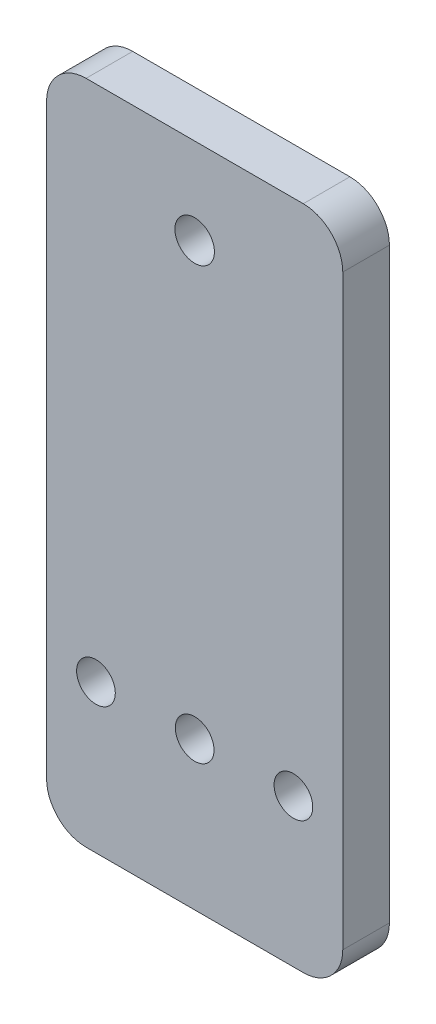
ISO-10303-21;
HEADER;
FILE_DESCRIPTION(('STEP AP214'),'2;1');
FILE_NAME('part.step','',(''),(''),'','','');
FILE_SCHEMA(('AUTOMOTIVE_DESIGN { 1 0 10303 214 1 1 1 1 }'));
ENDSEC;
DATA;
#1=APPLICATION_CONTEXT('core data for automotive mechanical design processes');
#2=APPLICATION_PROTOCOL_DEFINITION('international standard','automotive_design',2000,#1);
#3=PRODUCT_CONTEXT('',#1,'mechanical');
#4=PRODUCT('Part','Part','',(#3));
#5=PRODUCT_RELATED_PRODUCT_CATEGORY('part','',(#4));
#6=PRODUCT_DEFINITION_FORMATION('','',#4);
#7=PRODUCT_DEFINITION_CONTEXT('part definition',#1,'design');
#8=PRODUCT_DEFINITION('design','',#6,#7);
#9=PRODUCT_DEFINITION_SHAPE('','',#8);
#10=(LENGTH_UNIT() NAMED_UNIT(*) SI_UNIT(.MILLI.,.METRE.));
#11=(NAMED_UNIT(*) PLANE_ANGLE_UNIT() SI_UNIT($,.RADIAN.));
#12=(NAMED_UNIT(*) SI_UNIT($,.STERADIAN.) SOLID_ANGLE_UNIT());
#13=UNCERTAINTY_MEASURE_WITH_UNIT(LENGTH_MEASURE(1.E-05),#10,'distance_accuracy_value','');
#14=(GEOMETRIC_REPRESENTATION_CONTEXT(3) GLOBAL_UNCERTAINTY_ASSIGNED_CONTEXT((#13)) GLOBAL_UNIT_ASSIGNED_CONTEXT((#10,
#11,#12)) REPRESENTATION_CONTEXT('',''));
#15=CARTESIAN_POINT('',(0.,0.,0.));
#16=DIRECTION('',(0.,0.,1.));
#17=DIRECTION('',(1.,0.,0.));
#18=AXIS2_PLACEMENT_3D('',#15,#16,#17);
#19=CARTESIAN_POINT('',(-354.33,-13.97,6.));
#20=DIRECTION('',(0.,0.,1.));
#21=DIRECTION('',(1.,0.,0.));
#22=AXIS2_PLACEMENT_3D('',#19,#20,#21);
#23=PLANE('',#22);
#24=CARTESIAN_POINT('',(-381.,0.,6.));
#25=DIRECTION('',(0.,0.,1.));
#26=DIRECTION('',(1.,0.,0.));
#27=AXIS2_PLACEMENT_3D('',#24,#25,#26);
#28=CIRCLE('',#27,2.4892);
#29=CARTESIAN_POINT('',(-378.5108,0.,6.));
#30=VERTEX_POINT('',#29);
#31=EDGE_CURVE('E221',#30,#30,#28,.T.);
#32=ORIENTED_EDGE('',*,*,#31,.F.);
#33=EDGE_LOOP('',(#32));
#34=FACE_BOUND('',#33,.T.);
#35=CARTESIAN_POINT('',(-368.3,0.,6.));
#36=DIRECTION('',(0.,0.,1.));
#37=DIRECTION('',(1.,0.,0.));
#38=AXIS2_PLACEMENT_3D('',#35,#36,#37);
#39=CIRCLE('',#38,2.4892);
#40=CARTESIAN_POINT('',(-365.8108,0.,6.));
#41=VERTEX_POINT('',#40);
#42=EDGE_CURVE('E146',#41,#41,#39,.T.);
#43=ORIENTED_EDGE('',*,*,#42,.F.);
#44=EDGE_LOOP('',(#43));
#45=FACE_BOUND('',#44,.T.);
#46=CARTESIAN_POINT('',(-354.33,-13.97,6.));
#47=DIRECTION('',(0.,0.,1.));
#48=DIRECTION('',(1.,0.,0.));
#49=AXIS2_PLACEMENT_3D('',#46,#47,#48);
#50=CIRCLE('',#49,5.07999999999999);
#51=CARTESIAN_POINT('',(-354.33,-19.05,6.));
#52=VERTEX_POINT('',#51);
#53=CARTESIAN_POINT('',(-349.25,-13.97,6.));
#54=VERTEX_POINT('',#53);
#55=EDGE_CURVE('E164',#52,#54,#50,.T.);
#56=ORIENTED_EDGE('',*,*,#55,.T.);
#57=DIRECTION('',(0.,1.,0.));
#58=VECTOR('',#57,1.);
#59=CARTESIAN_POINT('',(-349.25,-13.97,6.));
#60=LINE('',#59,#58);
#61=CARTESIAN_POINT('',(-349.25,61.53,6.));
#62=VERTEX_POINT('',#61);
#63=EDGE_CURVE('E100',#54,#62,#60,.T.);
#64=ORIENTED_EDGE('',*,*,#63,.T.);
#65=CARTESIAN_POINT('',(-354.33,61.53,6.));
#66=DIRECTION('',(0.,0.,1.));
#67=DIRECTION('',(1.,0.,0.));
#68=AXIS2_PLACEMENT_3D('',#65,#66,#67);
#69=CIRCLE('',#68,5.07999999999999);
#70=CARTESIAN_POINT('',(-354.33,66.61,6.));
#71=VERTEX_POINT('',#70);
#72=EDGE_CURVE('E185',#62,#71,#69,.T.);
#73=ORIENTED_EDGE('',*,*,#72,.T.);
#74=DIRECTION('',(-1.,0.,0.));
#75=VECTOR('',#74,1.);
#76=CARTESIAN_POINT('',(-354.33,66.61,6.));
#77=LINE('',#76,#75);
#78=CARTESIAN_POINT('',(-382.27,66.61,6.));
#79=VERTEX_POINT('',#78);
#80=EDGE_CURVE('E199',#71,#79,#77,.T.);
#81=ORIENTED_EDGE('',*,*,#80,.T.);
#82=CARTESIAN_POINT('',(-382.27,61.53,6.));
#83=DIRECTION('',(0.,0.,1.));
#84=DIRECTION('',(1.,0.,0.));
#85=AXIS2_PLACEMENT_3D('',#82,#83,#84);
#86=CIRCLE('',#85,5.07999999999996);
#87=CARTESIAN_POINT('',(-387.35,61.53,6.));
#88=VERTEX_POINT('',#87);
#89=EDGE_CURVE('E119',#79,#88,#86,.T.);
#90=ORIENTED_EDGE('',*,*,#89,.T.);
#91=DIRECTION('',(0.,-1.,0.));
#92=VECTOR('',#91,1.);
#93=CARTESIAN_POINT('',(-387.35,61.53,6.));
#94=LINE('',#93,#92);
#95=CARTESIAN_POINT('',(-387.35,-13.97,6.));
#96=VERTEX_POINT('',#95);
#97=EDGE_CURVE('E113',#88,#96,#94,.T.);
#98=ORIENTED_EDGE('',*,*,#97,.T.);
#99=CARTESIAN_POINT('',(-382.27,-13.97,6.));
#100=DIRECTION('',(0.,0.,1.));
#101=DIRECTION('',(1.,0.,0.));
#102=AXIS2_PLACEMENT_3D('',#99,#100,#101);
#103=CIRCLE('',#102,5.08000000000002);
#104=CARTESIAN_POINT('',(-382.27,-19.05,6.));
#105=VERTEX_POINT('',#104);
#106=EDGE_CURVE('E117',#96,#105,#103,.T.);
#107=ORIENTED_EDGE('',*,*,#106,.T.);
#108=DIRECTION('',(1.,0.,0.));
#109=VECTOR('',#108,1.);
#110=CARTESIAN_POINT('',(-382.27,-19.05,6.));
#111=LINE('',#110,#109);
#112=EDGE_CURVE('E57',#105,#52,#111,.T.);
#113=ORIENTED_EDGE('',*,*,#112,.T.);
#114=EDGE_LOOP('',(#56,#64,#73,#81,#90,#98,#107,#113));
#115=FACE_BOUND('',#114,.T.);
#116=CARTESIAN_POINT('',(-355.6,0.,6.));
#117=DIRECTION('',(0.,0.,1.));
#118=DIRECTION('',(1.,0.,0.));
#119=AXIS2_PLACEMENT_3D('',#116,#117,#118);
#120=CIRCLE('',#119,2.4892);
#121=CARTESIAN_POINT('',(-353.1108,0.,6.));
#122=VERTEX_POINT('',#121);
#123=EDGE_CURVE('E213',#122,#122,#120,.T.);
#124=ORIENTED_EDGE('',*,*,#123,.F.);
#125=EDGE_LOOP('',(#124));
#126=FACE_BOUND('',#125,.T.);
#127=CARTESIAN_POINT('',(-368.3,55.53,6.));
#128=DIRECTION('',(0.,0.,1.));
#129=DIRECTION('',(1.,0.,0.));
#130=AXIS2_PLACEMENT_3D('',#127,#128,#129);
#131=CIRCLE('',#130,2.54000000000001);
#132=CARTESIAN_POINT('',(-365.76,55.53,6.));
#133=VERTEX_POINT('',#132);
#134=EDGE_CURVE('E229',#133,#133,#131,.T.);
#135=ORIENTED_EDGE('',*,*,#134,.F.);
#136=EDGE_LOOP('',(#135));
#137=FACE_BOUND('',#136,.T.);
#138=ADVANCED_FACE('F39',(#34,#45,#115,#126,#137),#23,.T.);
#139=CARTESIAN_POINT('',(-354.33,-13.97,0.));
#140=DIRECTION('',(0.,0.,1.));
#141=DIRECTION('',(1.,0.,0.));
#142=AXIS2_PLACEMENT_3D('',#139,#140,#141);
#143=PLANE('',#142);
#144=CARTESIAN_POINT('',(-354.33,-13.97,0.));
#145=DIRECTION('',(0.,0.,1.));
#146=DIRECTION('',(1.,0.,0.));
#147=AXIS2_PLACEMENT_3D('',#144,#145,#146);
#148=CIRCLE('',#147,5.07999999999999);
#149=CARTESIAN_POINT('',(-354.33,-19.05,0.));
#150=VERTEX_POINT('',#149);
#151=CARTESIAN_POINT('',(-349.25,-13.97,0.));
#152=VERTEX_POINT('',#151);
#153=EDGE_CURVE('E141',#150,#152,#148,.T.);
#154=ORIENTED_EDGE('',*,*,#153,.F.);
#155=DIRECTION('',(1.,0.,0.));
#156=VECTOR('',#155,1.);
#157=CARTESIAN_POINT('',(-382.27,-19.05,0.));
#158=LINE('',#157,#156);
#159=CARTESIAN_POINT('',(-382.27,-19.05,0.));
#160=VERTEX_POINT('',#159);
#161=EDGE_CURVE('E92',#160,#150,#158,.T.);
#162=ORIENTED_EDGE('',*,*,#161,.F.);
#163=CARTESIAN_POINT('',(-382.27,-13.97,0.));
#164=DIRECTION('',(0.,0.,1.));
#165=DIRECTION('',(1.,0.,0.));
#166=AXIS2_PLACEMENT_3D('',#163,#164,#165);
#167=CIRCLE('',#166,5.08000000000002);
#168=CARTESIAN_POINT('',(-387.35,-13.97,0.));
#169=VERTEX_POINT('',#168);
#170=EDGE_CURVE('E86',#169,#160,#167,.T.);
#171=ORIENTED_EDGE('',*,*,#170,.F.);
#172=DIRECTION('',(0.,-1.,0.));
#173=VECTOR('',#172,1.);
#174=CARTESIAN_POINT('',(-387.35,61.53,0.));
#175=LINE('',#174,#173);
#176=CARTESIAN_POINT('',(-387.35,61.53,0.));
#177=VERTEX_POINT('',#176);
#178=EDGE_CURVE('E128',#177,#169,#175,.T.);
#179=ORIENTED_EDGE('',*,*,#178,.F.);
#180=CARTESIAN_POINT('',(-382.27,61.53,0.));
#181=DIRECTION('',(0.,0.,1.));
#182=DIRECTION('',(1.,0.,0.));
#183=AXIS2_PLACEMENT_3D('',#180,#181,#182);
#184=CIRCLE('',#183,5.07999999999996);
#185=CARTESIAN_POINT('',(-382.27,66.61,0.));
#186=VERTEX_POINT('',#185);
#187=EDGE_CURVE('E155',#186,#177,#184,.T.);
#188=ORIENTED_EDGE('',*,*,#187,.F.);
#189=DIRECTION('',(-1.,0.,0.));
#190=VECTOR('',#189,1.);
#191=CARTESIAN_POINT('',(-354.33,66.61,0.));
#192=LINE('',#191,#190);
#193=CARTESIAN_POINT('',(-354.33,66.61,0.));
#194=VERTEX_POINT('',#193);
#195=EDGE_CURVE('E152',#194,#186,#192,.T.);
#196=ORIENTED_EDGE('',*,*,#195,.F.);
#197=CARTESIAN_POINT('',(-354.33,61.53,0.));
#198=DIRECTION('',(0.,0.,1.));
#199=DIRECTION('',(1.,0.,0.));
#200=AXIS2_PLACEMENT_3D('',#197,#198,#199);
#201=CIRCLE('',#200,5.07999999999999);
#202=CARTESIAN_POINT('',(-349.25,61.53,0.));
#203=VERTEX_POINT('',#202);
#204=EDGE_CURVE('E149',#203,#194,#201,.T.);
#205=ORIENTED_EDGE('',*,*,#204,.F.);
#206=DIRECTION('',(0.,1.,0.));
#207=VECTOR('',#206,1.);
#208=CARTESIAN_POINT('',(-349.25,-13.97,0.));
#209=LINE('',#208,#207);
#210=EDGE_CURVE('E145',#152,#203,#209,.T.);
#211=ORIENTED_EDGE('',*,*,#210,.F.);
#212=EDGE_LOOP('',(#154,#162,#171,#179,#188,#196,#205,#211));
#213=FACE_BOUND('',#212,.T.);
#214=CARTESIAN_POINT('',(-368.3,0.,0.));
#215=DIRECTION('',(0.,0.,1.));
#216=DIRECTION('',(1.,0.,0.));
#217=AXIS2_PLACEMENT_3D('',#214,#215,#216);
#218=CIRCLE('',#217,2.4892);
#219=CARTESIAN_POINT('',(-365.8108,0.,0.));
#220=VERTEX_POINT('',#219);
#221=EDGE_CURVE('E209',#220,#220,#218,.T.);
#222=ORIENTED_EDGE('',*,*,#221,.T.);
#223=EDGE_LOOP('',(#222));
#224=FACE_BOUND('',#223,.T.);
#225=CARTESIAN_POINT('',(-355.6,0.,0.));
#226=DIRECTION('',(0.,0.,1.));
#227=DIRECTION('',(1.,0.,0.));
#228=AXIS2_PLACEMENT_3D('',#225,#226,#227);
#229=CIRCLE('',#228,2.4892);
#230=CARTESIAN_POINT('',(-353.1108,0.,0.));
#231=VERTEX_POINT('',#230);
#232=EDGE_CURVE('E217',#231,#231,#229,.T.);
#233=ORIENTED_EDGE('',*,*,#232,.T.);
#234=EDGE_LOOP('',(#233));
#235=FACE_BOUND('',#234,.T.);
#236=CARTESIAN_POINT('',(-381.,0.,0.));
#237=DIRECTION('',(0.,0.,1.));
#238=DIRECTION('',(1.,0.,0.));
#239=AXIS2_PLACEMENT_3D('',#236,#237,#238);
#240=CIRCLE('',#239,2.4892);
#241=CARTESIAN_POINT('',(-378.5108,0.,0.));
#242=VERTEX_POINT('',#241);
#243=EDGE_CURVE('E225',#242,#242,#240,.T.);
#244=ORIENTED_EDGE('',*,*,#243,.T.);
#245=EDGE_LOOP('',(#244));
#246=FACE_BOUND('',#245,.T.);
#247=CARTESIAN_POINT('',(-368.3,55.53,0.));
#248=DIRECTION('',(0.,0.,1.));
#249=DIRECTION('',(1.,0.,0.));
#250=AXIS2_PLACEMENT_3D('',#247,#248,#249);
#251=CIRCLE('',#250,2.54000000000001);
#252=CARTESIAN_POINT('',(-365.76,55.53,0.));
#253=VERTEX_POINT('',#252);
#254=EDGE_CURVE('E233',#253,#253,#251,.T.);
#255=ORIENTED_EDGE('',*,*,#254,.T.);
#256=EDGE_LOOP('',(#255));
#257=FACE_BOUND('',#256,.T.);
#258=ADVANCED_FACE('F189',(#213,#224,#235,#246,#257),#143,.F.);
#259=CARTESIAN_POINT('',(-354.33,-13.97,6.));
#260=DIRECTION('',(0.,0.,-1.));
#261=DIRECTION('',(-1.,0.,0.));
#262=AXIS2_PLACEMENT_3D('',#259,#260,#261);
#263=CYLINDRICAL_SURFACE('',#262,5.07999999999999);
#264=ORIENTED_EDGE('',*,*,#153,.T.);
#265=DIRECTION('',(0.,0.,-1.));
#266=VECTOR('',#265,1.);
#267=CARTESIAN_POINT('',(-349.25,-13.97,6.));
#268=LINE('',#267,#266);
#269=EDGE_CURVE('E11',#54,#152,#268,.T.);
#270=ORIENTED_EDGE('',*,*,#269,.F.);
#271=ORIENTED_EDGE('',*,*,#55,.F.);
#272=DIRECTION('',(0.,0.,-1.));
#273=VECTOR('',#272,1.);
#274=CARTESIAN_POINT('',(-354.33,-19.05,6.));
#275=LINE('',#274,#273);
#276=EDGE_CURVE('E137',#52,#150,#275,.T.);
#277=ORIENTED_EDGE('',*,*,#276,.T.);
#278=EDGE_LOOP('',(#264,#270,#271,#277));
#279=FACE_BOUND('',#278,.T.);
#280=ADVANCED_FACE('F41',(#279),#263,.T.);
#281=CARTESIAN_POINT('',(-349.25,-13.97,6.));
#282=DIRECTION('',(-1.,0.,0.));
#283=DIRECTION('',(0.,0.,1.));
#284=AXIS2_PLACEMENT_3D('',#281,#282,#283);
#285=PLANE('',#284);
#286=ORIENTED_EDGE('',*,*,#210,.T.);
#287=DIRECTION('',(0.,0.,-1.));
#288=VECTOR('',#287,1.);
#289=CARTESIAN_POINT('',(-349.25,61.53,6.));
#290=LINE('',#289,#288);
#291=EDGE_CURVE('E49',#62,#203,#290,.T.);
#292=ORIENTED_EDGE('',*,*,#291,.F.);
#293=ORIENTED_EDGE('',*,*,#63,.F.);
#294=ORIENTED_EDGE('',*,*,#269,.T.);
#295=EDGE_LOOP('',(#286,#292,#293,#294));
#296=FACE_BOUND('',#295,.T.);
#297=ADVANCED_FACE('F269',(#296),#285,.F.);
#298=CARTESIAN_POINT('',(-354.33,61.53,6.));
#299=DIRECTION('',(0.,0.,-1.));
#300=DIRECTION('',(-1.,0.,0.));
#301=AXIS2_PLACEMENT_3D('',#298,#299,#300);
#302=CYLINDRICAL_SURFACE('',#301,5.07999999999999);
#303=ORIENTED_EDGE('',*,*,#204,.T.);
#304=DIRECTION('',(0.,0.,-1.));
#305=VECTOR('',#304,1.);
#306=CARTESIAN_POINT('',(-354.33,66.61,6.));
#307=LINE('',#306,#305);
#308=EDGE_CURVE('E175',#71,#194,#307,.T.);
#309=ORIENTED_EDGE('',*,*,#308,.F.);
#310=ORIENTED_EDGE('',*,*,#72,.F.);
#311=ORIENTED_EDGE('',*,*,#291,.T.);
#312=EDGE_LOOP('',(#303,#309,#310,#311));
#313=FACE_BOUND('',#312,.T.);
#314=ADVANCED_FACE('F183',(#313),#302,.T.);
#315=CARTESIAN_POINT('',(-354.33,66.61,6.));
#316=DIRECTION('',(0.,-1.,0.));
#317=DIRECTION('',(0.,0.,-1.));
#318=AXIS2_PLACEMENT_3D('',#315,#316,#317);
#319=PLANE('',#318);
#320=ORIENTED_EDGE('',*,*,#195,.T.);
#321=DIRECTION('',(0.,0.,-1.));
#322=VECTOR('',#321,1.);
#323=CARTESIAN_POINT('',(-382.27,66.61,6.));
#324=LINE('',#323,#322);
#325=EDGE_CURVE('E171',#79,#186,#324,.T.);
#326=ORIENTED_EDGE('',*,*,#325,.F.);
#327=ORIENTED_EDGE('',*,*,#80,.F.);
#328=ORIENTED_EDGE('',*,*,#308,.T.);
#329=EDGE_LOOP('',(#320,#326,#327,#328));
#330=FACE_BOUND('',#329,.T.);
#331=ADVANCED_FACE('F194',(#330),#319,.F.);
#332=CARTESIAN_POINT('',(-382.27,61.53,6.));
#333=DIRECTION('',(0.,0.,-1.));
#334=DIRECTION('',(-1.,0.,0.));
#335=AXIS2_PLACEMENT_3D('',#332,#333,#334);
#336=CYLINDRICAL_SURFACE('',#335,5.07999999999996);
#337=ORIENTED_EDGE('',*,*,#187,.T.);
#338=DIRECTION('',(0.,0.,-1.));
#339=VECTOR('',#338,1.);
#340=CARTESIAN_POINT('',(-387.35,61.53,6.));
#341=LINE('',#340,#339);
#342=EDGE_CURVE('E130',#88,#177,#341,.T.);
#343=ORIENTED_EDGE('',*,*,#342,.F.);
#344=ORIENTED_EDGE('',*,*,#89,.F.);
#345=ORIENTED_EDGE('',*,*,#325,.T.);
#346=EDGE_LOOP('',(#337,#343,#344,#345));
#347=FACE_BOUND('',#346,.T.);
#348=ADVANCED_FACE('F197',(#347),#336,.T.);
#349=CARTESIAN_POINT('',(-387.35,61.53,6.));
#350=DIRECTION('',(1.,0.,0.));
#351=DIRECTION('',(0.,1.,0.));
#352=AXIS2_PLACEMENT_3D('',#349,#350,#351);
#353=PLANE('',#352);
#354=ORIENTED_EDGE('',*,*,#178,.T.);
#355=DIRECTION('',(0.,0.,-1.));
#356=VECTOR('',#355,1.);
#357=CARTESIAN_POINT('',(-387.35,-13.97,6.));
#358=LINE('',#357,#356);
#359=EDGE_CURVE('E125',#96,#169,#358,.T.);
#360=ORIENTED_EDGE('',*,*,#359,.F.);
#361=ORIENTED_EDGE('',*,*,#97,.F.);
#362=ORIENTED_EDGE('',*,*,#342,.T.);
#363=EDGE_LOOP('',(#354,#360,#361,#362));
#364=FACE_BOUND('',#363,.T.);
#365=ADVANCED_FACE('F126',(#364),#353,.F.);
#366=CARTESIAN_POINT('',(-382.27,-13.97,6.));
#367=DIRECTION('',(0.,0.,-1.));
#368=DIRECTION('',(-1.,0.,0.));
#369=AXIS2_PLACEMENT_3D('',#366,#367,#368);
#370=CYLINDRICAL_SURFACE('',#369,5.08000000000002);
#371=ORIENTED_EDGE('',*,*,#170,.T.);
#372=DIRECTION('',(0.,0.,-1.));
#373=VECTOR('',#372,1.);
#374=CARTESIAN_POINT('',(-382.27,-19.05,6.));
#375=LINE('',#374,#373);
#376=EDGE_CURVE('E131',#105,#160,#375,.T.);
#377=ORIENTED_EDGE('',*,*,#376,.F.);
#378=ORIENTED_EDGE('',*,*,#106,.F.);
#379=ORIENTED_EDGE('',*,*,#359,.T.);
#380=EDGE_LOOP('',(#371,#377,#378,#379));
#381=FACE_BOUND('',#380,.T.);
#382=ADVANCED_FACE('F133',(#381),#370,.T.);
#383=CARTESIAN_POINT('',(-382.27,-19.05,6.));
#384=DIRECTION('',(0.,1.,0.));
#385=DIRECTION('',(-1.,0.,0.));
#386=AXIS2_PLACEMENT_3D('',#383,#384,#385);
#387=PLANE('',#386);
#388=ORIENTED_EDGE('',*,*,#161,.T.);
#389=ORIENTED_EDGE('',*,*,#276,.F.);
#390=ORIENTED_EDGE('',*,*,#112,.F.);
#391=ORIENTED_EDGE('',*,*,#376,.T.);
#392=EDGE_LOOP('',(#388,#389,#390,#391));
#393=FACE_BOUND('',#392,.T.);
#394=ADVANCED_FACE('F257',(#393),#387,.F.);
#395=CARTESIAN_POINT('',(-368.3,0.,6.));
#396=DIRECTION('',(0.,0.,-1.));
#397=DIRECTION('',(-1.,0.,0.));
#398=AXIS2_PLACEMENT_3D('',#395,#396,#397);
#399=CYLINDRICAL_SURFACE('',#398,2.4892);
#400=ORIENTED_EDGE('',*,*,#42,.T.);
#401=EDGE_LOOP('',(#400));
#402=FACE_BOUND('',#401,.T.);
#403=ORIENTED_EDGE('',*,*,#221,.F.);
#404=EDGE_LOOP('',(#403));
#405=FACE_BOUND('',#404,.T.);
#406=ADVANCED_FACE('F254',(#402,#405),#399,.F.);
#407=CARTESIAN_POINT('',(-355.6,0.,6.));
#408=DIRECTION('',(0.,0.,-1.));
#409=DIRECTION('',(-1.,0.,0.));
#410=AXIS2_PLACEMENT_3D('',#407,#408,#409);
#411=CYLINDRICAL_SURFACE('',#410,2.4892);
#412=ORIENTED_EDGE('',*,*,#123,.T.);
#413=EDGE_LOOP('',(#412));
#414=FACE_BOUND('',#413,.T.);
#415=ORIENTED_EDGE('',*,*,#232,.F.);
#416=EDGE_LOOP('',(#415));
#417=FACE_BOUND('',#416,.T.);
#418=ADVANCED_FACE('F333',(#414,#417),#411,.F.);
#419=CARTESIAN_POINT('',(-381.,0.,6.));
#420=DIRECTION('',(0.,0.,-1.));
#421=DIRECTION('',(-1.,0.,0.));
#422=AXIS2_PLACEMENT_3D('',#419,#420,#421);
#423=CYLINDRICAL_SURFACE('',#422,2.4892);
#424=ORIENTED_EDGE('',*,*,#31,.T.);
#425=EDGE_LOOP('',(#424));
#426=FACE_BOUND('',#425,.T.);
#427=ORIENTED_EDGE('',*,*,#243,.F.);
#428=EDGE_LOOP('',(#427));
#429=FACE_BOUND('',#428,.T.);
#430=ADVANCED_FACE('F341',(#426,#429),#423,.F.);
#431=CARTESIAN_POINT('',(-368.3,55.53,6.));
#432=DIRECTION('',(0.,0.,-1.));
#433=DIRECTION('',(-1.,0.,0.));
#434=AXIS2_PLACEMENT_3D('',#431,#432,#433);
#435=CYLINDRICAL_SURFACE('',#434,2.54000000000001);
#436=ORIENTED_EDGE('',*,*,#134,.T.);
#437=EDGE_LOOP('',(#436));
#438=FACE_BOUND('',#437,.T.);
#439=ORIENTED_EDGE('',*,*,#254,.F.);
#440=EDGE_LOOP('',(#439));
#441=FACE_BOUND('',#440,.T.);
#442=ADVANCED_FACE('F241',(#438,#441),#435,.F.);
#443=CLOSED_SHELL('',(#138,#258,#280,#297,#314,#331,#348,#365,#382,#394,#406,#418,#430,#442));
#444=MANIFOLD_SOLID_BREP('B2',#443);
#445=ADVANCED_BREP_SHAPE_REPRESENTATION('',(#18,#444),#14);
#446=SHAPE_DEFINITION_REPRESENTATION(#9,#445);
ENDSEC;
END-ISO-10303-21;
